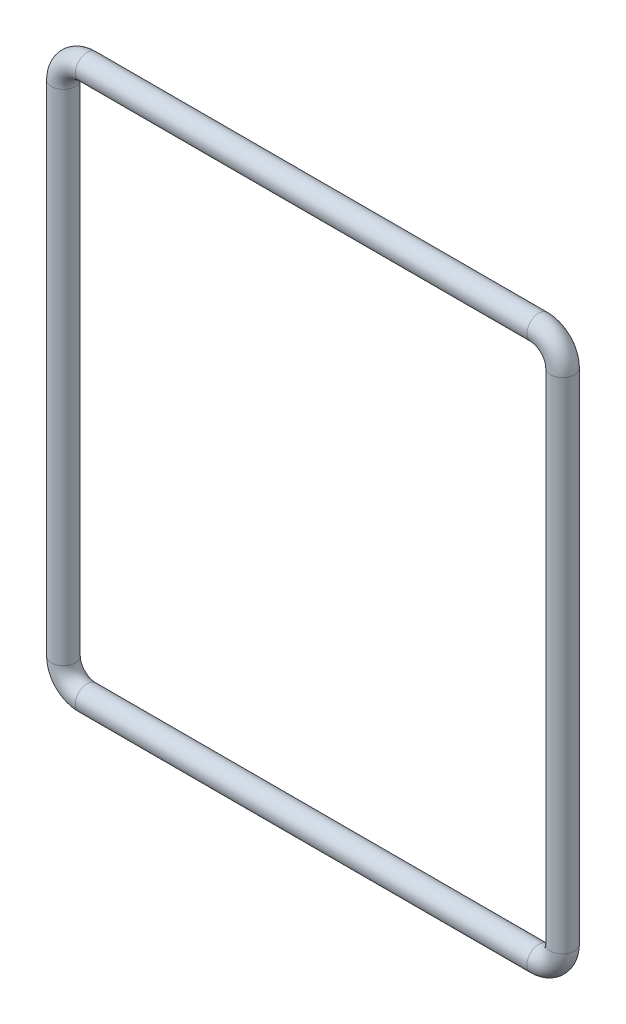
ISO-10303-21;
HEADER;
FILE_DESCRIPTION(('STEP AP214'),'2;1');
FILE_NAME('part.step','',(''),(''),'','','');
FILE_SCHEMA(('AUTOMOTIVE_DESIGN { 1 0 10303 214 1 1 1 1 }'));
ENDSEC;
DATA;
#1=APPLICATION_CONTEXT('core data for automotive mechanical design processes');
#2=APPLICATION_PROTOCOL_DEFINITION('international standard','automotive_design',2000,#1);
#3=PRODUCT_CONTEXT('',#1,'mechanical');
#4=PRODUCT('Part','Part','',(#3));
#5=PRODUCT_RELATED_PRODUCT_CATEGORY('part','',(#4));
#6=PRODUCT_DEFINITION_FORMATION('','',#4);
#7=PRODUCT_DEFINITION_CONTEXT('part definition',#1,'design');
#8=PRODUCT_DEFINITION('design','',#6,#7);
#9=PRODUCT_DEFINITION_SHAPE('','',#8);
#10=(LENGTH_UNIT() NAMED_UNIT(*) SI_UNIT(.MILLI.,.METRE.));
#11=(NAMED_UNIT(*) PLANE_ANGLE_UNIT() SI_UNIT($,.RADIAN.));
#12=(NAMED_UNIT(*) SI_UNIT($,.STERADIAN.) SOLID_ANGLE_UNIT());
#13=UNCERTAINTY_MEASURE_WITH_UNIT(LENGTH_MEASURE(1.E-05),#10,'distance_accuracy_value','');
#14=(GEOMETRIC_REPRESENTATION_CONTEXT(3) GLOBAL_UNCERTAINTY_ASSIGNED_CONTEXT((#13)) GLOBAL_UNIT_ASSIGNED_CONTEXT((#10,
#11,#12)) REPRESENTATION_CONTEXT('',''));
#15=CARTESIAN_POINT('',(0.,0.,0.));
#16=DIRECTION('',(0.,0.,1.));
#17=DIRECTION('',(1.,0.,0.));
#18=AXIS2_PLACEMENT_3D('',#15,#16,#17);
#19=CARTESIAN_POINT('',(19.,21.,0.));
#20=DIRECTION('',(0.,0.,1.));
#21=DIRECTION('',(-1.,0.,0.));
#22=AXIS2_PLACEMENT_3D('',#19,#20,#21);
#23=TOROIDAL_SURFACE('',#22,2.,0.999999999999998);
#24=CARTESIAN_POINT('',(21.,21.,0.));
#25=DIRECTION('',(0.,-1.,0.));
#26=DIRECTION('',(0.,0.,-1.));
#27=AXIS2_PLACEMENT_3D('',#24,#25,#26);
#28=CIRCLE('',#27,0.999999999999998);
#29=CARTESIAN_POINT('',(22.,21.,0.));
#30=VERTEX_POINT('',#29);
#31=EDGE_CURVE('E10',#30,#30,#28,.T.);
#32=CARTESIAN_POINT('',(19.,23.,0.));
#33=DIRECTION('',(1.,0.,0.));
#34=DIRECTION('',(0.,0.,-1.));
#35=AXIS2_PLACEMENT_3D('',#32,#33,#34);
#36=CIRCLE('',#35,0.999999999999998);
#37=CARTESIAN_POINT('',(19.,24.,0.));
#38=VERTEX_POINT('',#37);
#39=EDGE_CURVE('E45',#38,#38,#36,.T.);
#40=CARTESIAN_POINT('',(19.,21.,0.));
#41=DIRECTION('',(0.,0.,1.));
#42=DIRECTION('',(-1.,0.,0.));
#43=AXIS2_PLACEMENT_3D('',#40,#41,#42);
#44=CIRCLE('',#43,3.);
#45=EDGE_CURVE('',#30,#38,#44,.T.);
#46=ORIENTED_EDGE('',*,*,#31,.F.);
#47=ORIENTED_EDGE('',*,*,#39,.T.);
#48=ORIENTED_EDGE('',*,*,#45,.T.);
#49=ORIENTED_EDGE('',*,*,#45,.F.);
#50=EDGE_LOOP('',(#46,#48,#47,#49));
#51=FACE_BOUND('',#50,.T.);
#52=ADVANCED_FACE('F39',(#51),#23,.T.);
#53=CARTESIAN_POINT('',(-19.,23.,0.));
#54=DIRECTION('',(1.,0.,0.));
#55=DIRECTION('',(0.,0.,1.));
#56=AXIS2_PLACEMENT_3D('',#53,#54,#55);
#57=CYLINDRICAL_SURFACE('',#56,0.999999999999998);
#58=CARTESIAN_POINT('',(-19.,23.,0.));
#59=DIRECTION('',(1.,0.,0.));
#60=DIRECTION('',(0.,0.,-1.));
#61=AXIS2_PLACEMENT_3D('',#58,#59,#60);
#62=CIRCLE('',#61,0.999999999999998);
#63=CARTESIAN_POINT('',(-19.,24.,0.));
#64=VERTEX_POINT('',#63);
#65=EDGE_CURVE('E49',#64,#64,#62,.T.);
#66=ORIENTED_EDGE('',*,*,#65,.T.);
#67=EDGE_LOOP('',(#66));
#68=FACE_BOUND('',#67,.T.);
#69=ORIENTED_EDGE('',*,*,#39,.F.);
#70=EDGE_LOOP('',(#69));
#71=FACE_BOUND('',#70,.T.);
#72=ADVANCED_FACE('F83',(#68,#71),#57,.T.);
#73=CARTESIAN_POINT('',(-19.,21.,0.));
#74=DIRECTION('',(0.,0.,1.));
#75=DIRECTION('',(-1.,0.,0.));
#76=AXIS2_PLACEMENT_3D('',#73,#74,#75);
#77=TOROIDAL_SURFACE('',#76,2.,0.999999999999998);
#78=CARTESIAN_POINT('',(-21.,21.,0.));
#79=DIRECTION('',(0.,1.,0.));
#80=DIRECTION('',(0.,0.,-1.));
#81=AXIS2_PLACEMENT_3D('',#78,#79,#80);
#82=CIRCLE('',#81,0.999999999999998);
#83=CARTESIAN_POINT('',(-22.,21.,0.));
#84=VERTEX_POINT('',#83);
#85=EDGE_CURVE('E53',#84,#84,#82,.T.);
#86=CARTESIAN_POINT('',(-19.,21.,0.));
#87=DIRECTION('',(0.,0.,1.));
#88=DIRECTION('',(-1.,0.,0.));
#89=AXIS2_PLACEMENT_3D('',#86,#87,#88);
#90=CIRCLE('',#89,3.);
#91=EDGE_CURVE('',#64,#84,#90,.T.);
#92=ORIENTED_EDGE('',*,*,#65,.F.);
#93=ORIENTED_EDGE('',*,*,#85,.T.);
#94=ORIENTED_EDGE('',*,*,#91,.T.);
#95=ORIENTED_EDGE('',*,*,#91,.F.);
#96=EDGE_LOOP('',(#92,#94,#93,#95));
#97=FACE_BOUND('',#96,.T.);
#98=ADVANCED_FACE('F87',(#97),#77,.T.);
#99=CARTESIAN_POINT('',(-21.,-21.,0.));
#100=DIRECTION('',(0.,1.,0.));
#101=DIRECTION('',(-1.,0.,0.));
#102=AXIS2_PLACEMENT_3D('',#99,#100,#101);
#103=CYLINDRICAL_SURFACE('',#102,0.999999999999998);
#104=CARTESIAN_POINT('',(-21.,-21.,0.));
#105=DIRECTION('',(0.,1.,0.));
#106=DIRECTION('',(0.,0.,-1.));
#107=AXIS2_PLACEMENT_3D('',#104,#105,#106);
#108=CIRCLE('',#107,0.999999999999998);
#109=CARTESIAN_POINT('',(-22.,-21.,0.));
#110=VERTEX_POINT('',#109);
#111=EDGE_CURVE('E58',#110,#110,#108,.T.);
#112=ORIENTED_EDGE('',*,*,#111,.T.);
#113=EDGE_LOOP('',(#112));
#114=FACE_BOUND('',#113,.T.);
#115=ORIENTED_EDGE('',*,*,#85,.F.);
#116=EDGE_LOOP('',(#115));
#117=FACE_BOUND('',#116,.T.);
#118=ADVANCED_FACE('F93',(#114,#117),#103,.T.);
#119=CARTESIAN_POINT('',(-19.,-21.,0.));
#120=DIRECTION('',(0.,0.,1.));
#121=DIRECTION('',(-1.,0.,0.));
#122=AXIS2_PLACEMENT_3D('',#119,#120,#121);
#123=TOROIDAL_SURFACE('',#122,2.,0.999999999999998);
#124=CARTESIAN_POINT('',(-19.,-23.,0.));
#125=DIRECTION('',(-1.,0.,0.));
#126=DIRECTION('',(0.,0.,-1.));
#127=AXIS2_PLACEMENT_3D('',#124,#125,#126);
#128=CIRCLE('',#127,0.999999999999998);
#129=CARTESIAN_POINT('',(-19.,-24.,0.));
#130=VERTEX_POINT('',#129);
#131=EDGE_CURVE('E61',#130,#130,#128,.T.);
#132=CARTESIAN_POINT('',(-19.,-21.,0.));
#133=DIRECTION('',(0.,0.,1.));
#134=DIRECTION('',(-1.,0.,0.));
#135=AXIS2_PLACEMENT_3D('',#132,#133,#134);
#136=CIRCLE('',#135,3.);
#137=EDGE_CURVE('',#110,#130,#136,.T.);
#138=ORIENTED_EDGE('',*,*,#111,.F.);
#139=ORIENTED_EDGE('',*,*,#131,.T.);
#140=ORIENTED_EDGE('',*,*,#137,.T.);
#141=ORIENTED_EDGE('',*,*,#137,.F.);
#142=EDGE_LOOP('',(#138,#140,#139,#141));
#143=FACE_BOUND('',#142,.T.);
#144=ADVANCED_FACE('F100',(#143),#123,.T.);
#145=CARTESIAN_POINT('',(19.,-23.,0.));
#146=DIRECTION('',(-1.,0.,0.));
#147=DIRECTION('',(0.,-1.,0.));
#148=AXIS2_PLACEMENT_3D('',#145,#146,#147);
#149=CYLINDRICAL_SURFACE('',#148,0.999999999999998);
#150=CARTESIAN_POINT('',(19.,-23.,0.));
#151=DIRECTION('',(-1.,0.,0.));
#152=DIRECTION('',(0.,0.,-1.));
#153=AXIS2_PLACEMENT_3D('',#150,#151,#152);
#154=CIRCLE('',#153,0.999999999999998);
#155=CARTESIAN_POINT('',(19.,-24.,0.));
#156=VERTEX_POINT('',#155);
#157=EDGE_CURVE('E64',#156,#156,#154,.T.);
#158=ORIENTED_EDGE('',*,*,#157,.T.);
#159=EDGE_LOOP('',(#158));
#160=FACE_BOUND('',#159,.T.);
#161=ORIENTED_EDGE('',*,*,#131,.F.);
#162=EDGE_LOOP('',(#161));
#163=FACE_BOUND('',#162,.T.);
#164=ADVANCED_FACE('F80',(#160,#163),#149,.T.);
#165=CARTESIAN_POINT('',(19.,-21.,0.));
#166=DIRECTION('',(0.,0.,1.));
#167=DIRECTION('',(-1.,0.,0.));
#168=AXIS2_PLACEMENT_3D('',#165,#166,#167);
#169=TOROIDAL_SURFACE('',#168,1.99999999999999,0.999999999999998);
#170=CARTESIAN_POINT('',(21.,-21.,0.));
#171=DIRECTION('',(0.,-1.,0.));
#172=DIRECTION('',(0.,0.,-1.));
#173=AXIS2_PLACEMENT_3D('',#170,#171,#172);
#174=CIRCLE('',#173,0.999999999999998);
#175=CARTESIAN_POINT('',(22.,-21.,0.));
#176=VERTEX_POINT('',#175);
#177=EDGE_CURVE('E67',#176,#176,#174,.T.);
#178=CARTESIAN_POINT('',(19.,-21.,0.));
#179=DIRECTION('',(0.,0.,1.));
#180=DIRECTION('',(-1.,0.,0.));
#181=AXIS2_PLACEMENT_3D('',#178,#179,#180);
#182=CIRCLE('',#181,2.99999999999999);
#183=EDGE_CURVE('',#156,#176,#182,.T.);
#184=ORIENTED_EDGE('',*,*,#157,.F.);
#185=ORIENTED_EDGE('',*,*,#177,.T.);
#186=ORIENTED_EDGE('',*,*,#183,.T.);
#187=ORIENTED_EDGE('',*,*,#183,.F.);
#188=EDGE_LOOP('',(#184,#186,#185,#187));
#189=FACE_BOUND('',#188,.T.);
#190=ADVANCED_FACE('F71',(#189),#169,.T.);
#191=CARTESIAN_POINT('',(21.,-21.,0.));
#192=DIRECTION('',(0.,1.,0.));
#193=DIRECTION('',(-1.,0.,0.));
#194=AXIS2_PLACEMENT_3D('',#191,#192,#193);
#195=CYLINDRICAL_SURFACE('',#194,0.999999999999998);
#196=ORIENTED_EDGE('',*,*,#177,.F.);
#197=EDGE_LOOP('',(#196));
#198=FACE_BOUND('',#197,.T.);
#199=ORIENTED_EDGE('',*,*,#31,.T.);
#200=EDGE_LOOP('',(#199));
#201=FACE_BOUND('',#200,.T.);
#202=ADVANCED_FACE('F74',(#198,#201),#195,.T.);
#203=CLOSED_SHELL('',(#52,#72,#98,#118,#144,#164,#190,#202));
#204=MANIFOLD_SOLID_BREP('B2',#203);
#205=ADVANCED_BREP_SHAPE_REPRESENTATION('',(#18,#204),#14);
#206=SHAPE_DEFINITION_REPRESENTATION(#9,#205);
ENDSEC;
END-ISO-10303-21;
